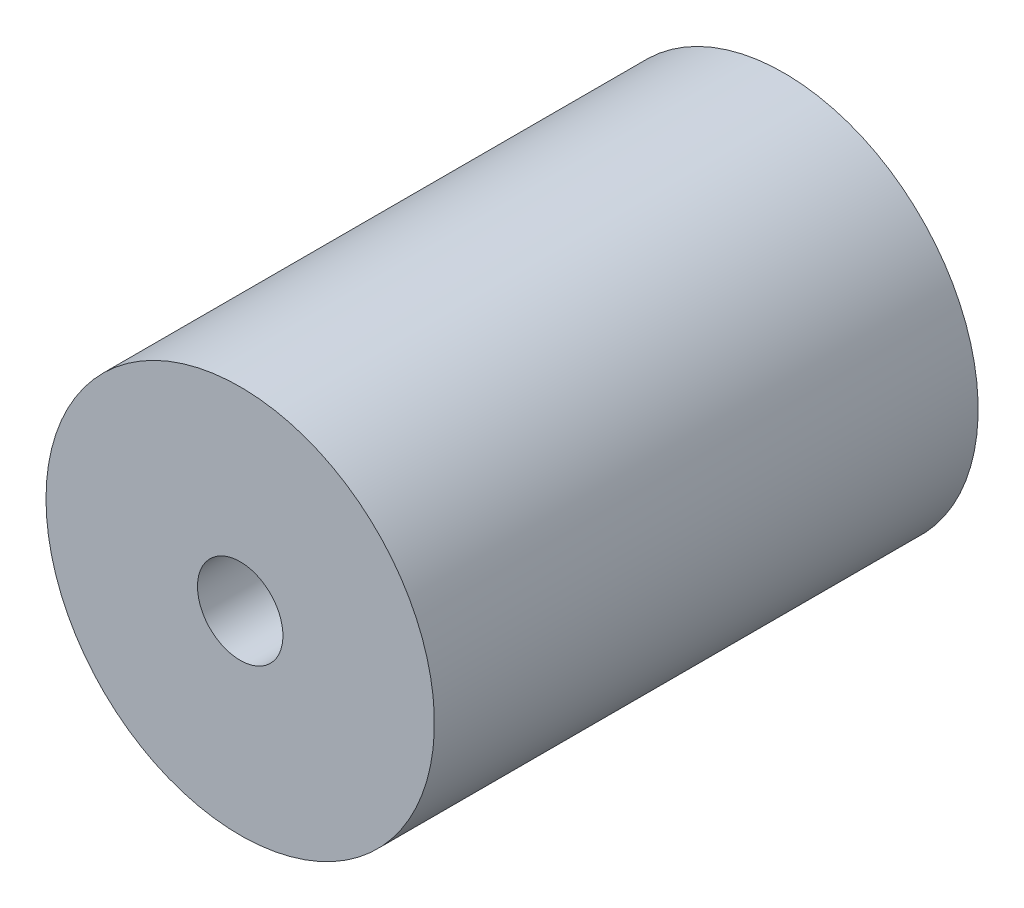
ISO-10303-21;
HEADER;
FILE_DESCRIPTION(('STEP AP214'),'2;1');
FILE_NAME('part.step','',(''),(''),'','','');
FILE_SCHEMA(('AUTOMOTIVE_DESIGN { 1 0 10303 214 1 1 1 1 }'));
ENDSEC;
DATA;
#1=APPLICATION_CONTEXT('core data for automotive mechanical design processes');
#2=APPLICATION_PROTOCOL_DEFINITION('international standard','automotive_design',2000,#1);
#3=PRODUCT_CONTEXT('',#1,'mechanical');
#4=PRODUCT('Part','Part','',(#3));
#5=PRODUCT_RELATED_PRODUCT_CATEGORY('part','',(#4));
#6=PRODUCT_DEFINITION_FORMATION('','',#4);
#7=PRODUCT_DEFINITION_CONTEXT('part definition',#1,'design');
#8=PRODUCT_DEFINITION('design','',#6,#7);
#9=PRODUCT_DEFINITION_SHAPE('','',#8);
#10=(LENGTH_UNIT() NAMED_UNIT(*) SI_UNIT(.MILLI.,.METRE.));
#11=(NAMED_UNIT(*) PLANE_ANGLE_UNIT() SI_UNIT($,.RADIAN.));
#12=(NAMED_UNIT(*) SI_UNIT($,.STERADIAN.) SOLID_ANGLE_UNIT());
#13=UNCERTAINTY_MEASURE_WITH_UNIT(LENGTH_MEASURE(1.E-05),#10,'distance_accuracy_value','');
#14=(GEOMETRIC_REPRESENTATION_CONTEXT(3) GLOBAL_UNCERTAINTY_ASSIGNED_CONTEXT((#13)) GLOBAL_UNIT_ASSIGNED_CONTEXT((#10,
#11,#12)) REPRESENTATION_CONTEXT('',''));
#15=CARTESIAN_POINT('',(0.,0.,0.));
#16=DIRECTION('',(0.,0.,1.));
#17=DIRECTION('',(1.,0.,0.));
#18=AXIS2_PLACEMENT_3D('',#15,#16,#17);
#19=CARTESIAN_POINT('',(0.,0.,21.));
#20=DIRECTION('',(0.,0.,1.));
#21=DIRECTION('',(1.,0.,0.));
#22=AXIS2_PLACEMENT_3D('',#19,#20,#21);
#23=PLANE('',#22);
#24=CARTESIAN_POINT('',(0.,0.,21.));
#25=DIRECTION('',(0.,0.,1.));
#26=DIRECTION('',(1.,0.,0.));
#27=AXIS2_PLACEMENT_3D('',#24,#25,#26);
#28=CIRCLE('',#27,7.5);
#29=CARTESIAN_POINT('',(-7.5,0.,21.));
#30=VERTEX_POINT('',#29);
#31=EDGE_CURVE('E10',#30,#30,#28,.T.);
#32=ORIENTED_EDGE('',*,*,#31,.T.);
#33=EDGE_LOOP('',(#32));
#34=FACE_BOUND('',#33,.T.);
#35=CARTESIAN_POINT('',(0.,0.,21.));
#36=DIRECTION('',(0.,0.,1.));
#37=DIRECTION('',(1.,0.,0.));
#38=AXIS2_PLACEMENT_3D('',#35,#36,#37);
#39=CIRCLE('',#38,1.65);
#40=CARTESIAN_POINT('',(-1.65,0.,21.));
#41=VERTEX_POINT('',#40);
#42=EDGE_CURVE('E44',#41,#41,#39,.T.);
#43=ORIENTED_EDGE('',*,*,#42,.F.);
#44=EDGE_LOOP('',(#43));
#45=FACE_BOUND('',#44,.T.);
#46=ADVANCED_FACE('F33',(#34,#45),#23,.T.);
#47=CARTESIAN_POINT('',(0.,0.,0.));
#48=DIRECTION('',(0.,0.,1.));
#49=DIRECTION('',(1.,0.,0.));
#50=AXIS2_PLACEMENT_3D('',#47,#48,#49);
#51=PLANE('',#50);
#52=CARTESIAN_POINT('',(0.,0.,0.));
#53=DIRECTION('',(0.,0.,1.));
#54=DIRECTION('',(1.,0.,0.));
#55=AXIS2_PLACEMENT_3D('',#52,#53,#54);
#56=CIRCLE('',#55,7.5);
#57=CARTESIAN_POINT('',(-7.5,0.,0.));
#58=VERTEX_POINT('',#57);
#59=EDGE_CURVE('E37',#58,#58,#56,.T.);
#60=ORIENTED_EDGE('',*,*,#59,.F.);
#61=EDGE_LOOP('',(#60));
#62=FACE_BOUND('',#61,.T.);
#63=CARTESIAN_POINT('',(0.,0.,0.));
#64=DIRECTION('',(0.,0.,1.));
#65=DIRECTION('',(1.,0.,0.));
#66=AXIS2_PLACEMENT_3D('',#63,#64,#65);
#67=CIRCLE('',#66,1.65);
#68=CARTESIAN_POINT('',(-1.65,0.,0.));
#69=VERTEX_POINT('',#68);
#70=EDGE_CURVE('E46',#69,#69,#67,.T.);
#71=ORIENTED_EDGE('',*,*,#70,.T.);
#72=EDGE_LOOP('',(#71));
#73=FACE_BOUND('',#72,.T.);
#74=ADVANCED_FACE('F56',(#62,#73),#51,.F.);
#75=CARTESIAN_POINT('',(0.,0.,21.));
#76=DIRECTION('',(0.,0.,-1.));
#77=DIRECTION('',(-1.,0.,0.));
#78=AXIS2_PLACEMENT_3D('',#75,#76,#77);
#79=CYLINDRICAL_SURFACE('',#78,7.5);
#80=CARTESIAN_POINT('',(-7.5,0.,21.));
#81=CARTESIAN_POINT('',(-7.5,0.,20.78125));
#82=CARTESIAN_POINT('',(-7.5,0.,20.5625));
#83=CARTESIAN_POINT('',(-7.5,0.,20.125));
#84=CARTESIAN_POINT('',(-7.5,0.,19.90625));
#85=CARTESIAN_POINT('',(-7.5,0.,19.46875));
#86=CARTESIAN_POINT('',(-7.5,0.,19.25));
#87=CARTESIAN_POINT('',(-7.5,0.,18.8125));
#88=CARTESIAN_POINT('',(-7.5,0.,18.59375));
#89=CARTESIAN_POINT('',(-7.5,0.,18.15625));
#90=CARTESIAN_POINT('',(-7.5,0.,17.9375));
#91=CARTESIAN_POINT('',(-7.5,0.,17.5));
#92=CARTESIAN_POINT('',(-7.5,0.,17.28125));
#93=CARTESIAN_POINT('',(-7.5,0.,16.84375));
#94=CARTESIAN_POINT('',(-7.5,0.,16.625));
#95=CARTESIAN_POINT('',(-7.5,0.,16.1875));
#96=CARTESIAN_POINT('',(-7.5,0.,15.96875));
#97=CARTESIAN_POINT('',(-7.5,0.,15.53125));
#98=CARTESIAN_POINT('',(-7.5,0.,15.3125));
#99=CARTESIAN_POINT('',(-7.5,0.,14.875));
#100=CARTESIAN_POINT('',(-7.5,0.,14.65625));
#101=CARTESIAN_POINT('',(-7.5,0.,14.21875));
#102=CARTESIAN_POINT('',(-7.5,0.,14.));
#103=CARTESIAN_POINT('',(-7.5,0.,13.5625));
#104=CARTESIAN_POINT('',(-7.5,0.,13.34375));
#105=CARTESIAN_POINT('',(-7.5,0.,12.90625));
#106=CARTESIAN_POINT('',(-7.5,0.,12.6875));
#107=CARTESIAN_POINT('',(-7.5,0.,12.25));
#108=CARTESIAN_POINT('',(-7.5,0.,12.03125));
#109=CARTESIAN_POINT('',(-7.5,0.,11.59375));
#110=CARTESIAN_POINT('',(-7.5,0.,11.375));
#111=CARTESIAN_POINT('',(-7.5,0.,10.9375));
#112=CARTESIAN_POINT('',(-7.5,0.,10.71875));
#113=CARTESIAN_POINT('',(-7.5,0.,10.28125));
#114=CARTESIAN_POINT('',(-7.5,0.,10.0625));
#115=CARTESIAN_POINT('',(-7.5,0.,9.625));
#116=CARTESIAN_POINT('',(-7.5,0.,9.40625));
#117=CARTESIAN_POINT('',(-7.5,0.,8.96875));
#118=CARTESIAN_POINT('',(-7.5,0.,8.75));
#119=CARTESIAN_POINT('',(-7.5,0.,8.3125));
#120=CARTESIAN_POINT('',(-7.5,0.,8.09375));
#121=CARTESIAN_POINT('',(-7.5,0.,7.65625));
#122=CARTESIAN_POINT('',(-7.5,0.,7.4375));
#123=CARTESIAN_POINT('',(-7.5,0.,7.));
#124=CARTESIAN_POINT('',(-7.5,0.,6.78125));
#125=CARTESIAN_POINT('',(-7.5,0.,6.34375));
#126=CARTESIAN_POINT('',(-7.5,0.,6.125));
#127=CARTESIAN_POINT('',(-7.5,0.,5.6875));
#128=CARTESIAN_POINT('',(-7.5,0.,5.46875));
#129=CARTESIAN_POINT('',(-7.5,0.,5.03125));
#130=CARTESIAN_POINT('',(-7.5,0.,4.8125));
#131=CARTESIAN_POINT('',(-7.5,0.,4.375));
#132=CARTESIAN_POINT('',(-7.5,0.,4.15625));
#133=CARTESIAN_POINT('',(-7.5,0.,3.71875));
#134=CARTESIAN_POINT('',(-7.5,0.,3.5));
#135=CARTESIAN_POINT('',(-7.5,0.,3.0625));
#136=CARTESIAN_POINT('',(-7.5,0.,2.84375));
#137=CARTESIAN_POINT('',(-7.5,0.,2.40625));
#138=CARTESIAN_POINT('',(-7.5,0.,2.1875));
#139=CARTESIAN_POINT('',(-7.5,0.,1.75));
#140=CARTESIAN_POINT('',(-7.5,0.,1.53125));
#141=CARTESIAN_POINT('',(-7.5,0.,1.09375));
#142=CARTESIAN_POINT('',(-7.5,0.,0.875000000000001));
#143=CARTESIAN_POINT('',(-7.5,0.,0.4375));
#144=CARTESIAN_POINT('',(-7.5,0.,0.21875));
#145=CARTESIAN_POINT('',(-7.5,0.,0.));
#146=B_SPLINE_CURVE_WITH_KNOTS('',3,(#80,#81,#82,#83,#84,#85,#86,#87,#88,#89,#90,#91,#92,#93,
#94,#95,#96,#97,#98,#99,#100,#101,#102,#103,#104,#105,#106,#107,#108,#109,#110,#111,#112,#113,
#114,#115,#116,#117,#118,#119,#120,#121,#122,#123,#124,#125,#126,#127,#128,#129,#130,#131,#132,
#133,#134,#135,#136,#137,#138,#139,#140,#141,#142,#143,#144,#145),.UNSPECIFIED.,.F.,.F.,(4,2,2,
2,2,2,2,2,2,2,2,2,2,2,2,2,2,2,2,2,2,2,2,2,2,2,2,2,2,2,2,2,4),(0.,0.656249999999997,1.3125,
1.96875,2.625,3.28125,3.9375,4.59375,5.25,5.90625,6.5625,7.21875,7.875,8.53125,9.1875,9.84375,
10.5,11.15625,11.8125,12.46875,13.125,13.78125,14.4375,15.09375,15.75,16.40625,17.0625,17.71875,
18.375,19.03125,19.6875,20.34375,21.),.UNSPECIFIED.);
#147=EDGE_CURVE('BSEAM35',#30,#58,#146,.T.);
#148=ORIENTED_EDGE('',*,*,#31,.F.);
#149=ORIENTED_EDGE('',*,*,#59,.T.);
#150=ORIENTED_EDGE('',*,*,#147,.T.);
#151=ORIENTED_EDGE('',*,*,#147,.F.);
#152=EDGE_LOOP('',(#148,#150,#149,#151));
#153=FACE_BOUND('',#152,.T.);
#154=ADVANCED_FACE('F35',(#153),#79,.T.);
#155=CARTESIAN_POINT('',(0.,0.,21.));
#156=DIRECTION('',(0.,0.,-1.));
#157=DIRECTION('',(-1.,0.,0.));
#158=AXIS2_PLACEMENT_3D('',#155,#156,#157);
#159=CYLINDRICAL_SURFACE('',#158,1.65);
#160=CARTESIAN_POINT('',(-1.65,0.,21.));
#161=CARTESIAN_POINT('',(-1.65,0.,20.78125));
#162=CARTESIAN_POINT('',(-1.65,0.,20.5625));
#163=CARTESIAN_POINT('',(-1.65,0.,20.125));
#164=CARTESIAN_POINT('',(-1.65,0.,19.90625));
#165=CARTESIAN_POINT('',(-1.65,0.,19.46875));
#166=CARTESIAN_POINT('',(-1.65,0.,19.25));
#167=CARTESIAN_POINT('',(-1.65,0.,18.8125));
#168=CARTESIAN_POINT('',(-1.65,0.,18.59375));
#169=CARTESIAN_POINT('',(-1.65,0.,18.15625));
#170=CARTESIAN_POINT('',(-1.65,0.,17.9375));
#171=CARTESIAN_POINT('',(-1.65,0.,17.5));
#172=CARTESIAN_POINT('',(-1.65,0.,17.28125));
#173=CARTESIAN_POINT('',(-1.65,0.,16.84375));
#174=CARTESIAN_POINT('',(-1.65,0.,16.625));
#175=CARTESIAN_POINT('',(-1.65,0.,16.1875));
#176=CARTESIAN_POINT('',(-1.65,0.,15.96875));
#177=CARTESIAN_POINT('',(-1.65,0.,15.53125));
#178=CARTESIAN_POINT('',(-1.65,0.,15.3125));
#179=CARTESIAN_POINT('',(-1.65,0.,14.875));
#180=CARTESIAN_POINT('',(-1.65,0.,14.65625));
#181=CARTESIAN_POINT('',(-1.65,0.,14.21875));
#182=CARTESIAN_POINT('',(-1.65,0.,14.));
#183=CARTESIAN_POINT('',(-1.65,0.,13.5625));
#184=CARTESIAN_POINT('',(-1.65,0.,13.34375));
#185=CARTESIAN_POINT('',(-1.65,0.,12.90625));
#186=CARTESIAN_POINT('',(-1.65,0.,12.6875));
#187=CARTESIAN_POINT('',(-1.65,0.,12.25));
#188=CARTESIAN_POINT('',(-1.65,0.,12.03125));
#189=CARTESIAN_POINT('',(-1.65,0.,11.59375));
#190=CARTESIAN_POINT('',(-1.65,0.,11.375));
#191=CARTESIAN_POINT('',(-1.65,0.,10.9375));
#192=CARTESIAN_POINT('',(-1.65,0.,10.71875));
#193=CARTESIAN_POINT('',(-1.65,0.,10.28125));
#194=CARTESIAN_POINT('',(-1.65,0.,10.0625));
#195=CARTESIAN_POINT('',(-1.65,0.,9.625));
#196=CARTESIAN_POINT('',(-1.65,0.,9.40625));
#197=CARTESIAN_POINT('',(-1.65,0.,8.96875));
#198=CARTESIAN_POINT('',(-1.65,0.,8.75));
#199=CARTESIAN_POINT('',(-1.65,0.,8.3125));
#200=CARTESIAN_POINT('',(-1.65,0.,8.09375));
#201=CARTESIAN_POINT('',(-1.65,0.,7.65625));
#202=CARTESIAN_POINT('',(-1.65,0.,7.4375));
#203=CARTESIAN_POINT('',(-1.65,0.,7.));
#204=CARTESIAN_POINT('',(-1.65,0.,6.78125));
#205=CARTESIAN_POINT('',(-1.65,0.,6.34375));
#206=CARTESIAN_POINT('',(-1.65,0.,6.125));
#207=CARTESIAN_POINT('',(-1.65,0.,5.6875));
#208=CARTESIAN_POINT('',(-1.65,0.,5.46875));
#209=CARTESIAN_POINT('',(-1.65,0.,5.03125));
#210=CARTESIAN_POINT('',(-1.65,0.,4.8125));
#211=CARTESIAN_POINT('',(-1.65,0.,4.375));
#212=CARTESIAN_POINT('',(-1.65,0.,4.15625));
#213=CARTESIAN_POINT('',(-1.65,0.,3.71875));
#214=CARTESIAN_POINT('',(-1.65,0.,3.5));
#215=CARTESIAN_POINT('',(-1.65,0.,3.0625));
#216=CARTESIAN_POINT('',(-1.65,0.,2.84375));
#217=CARTESIAN_POINT('',(-1.65,0.,2.40625));
#218=CARTESIAN_POINT('',(-1.65,0.,2.1875));
#219=CARTESIAN_POINT('',(-1.65,0.,1.75));
#220=CARTESIAN_POINT('',(-1.65,0.,1.53125));
#221=CARTESIAN_POINT('',(-1.65,0.,1.09375));
#222=CARTESIAN_POINT('',(-1.65,0.,0.875000000000001));
#223=CARTESIAN_POINT('',(-1.65,0.,0.4375));
#224=CARTESIAN_POINT('',(-1.65,0.,0.21875));
#225=CARTESIAN_POINT('',(-1.65,0.,0.));
#226=B_SPLINE_CURVE_WITH_KNOTS('',3,(#160,#161,#162,#163,#164,#165,#166,#167,#168,#169,#170,
#171,#172,#173,#174,#175,#176,#177,#178,#179,#180,#181,#182,#183,#184,#185,#186,#187,#188,#189,
#190,#191,#192,#193,#194,#195,#196,#197,#198,#199,#200,#201,#202,#203,#204,#205,#206,#207,#208,
#209,#210,#211,#212,#213,#214,#215,#216,#217,#218,#219,#220,#221,#222,#223,#224,#225),
.UNSPECIFIED.,.F.,.F.,(4,2,2,2,2,2,2,2,2,2,2,2,2,2,2,2,2,2,2,2,2,2,2,2,2,2,2,2,2,2,2,2,4),(0.,
0.656249999999997,1.3125,1.96875,2.625,3.28125,3.9375,4.59375,5.25,5.90625,6.5625,7.21875,7.875,
8.53125,9.1875,9.84375,10.5,11.15625,11.8125,12.46875,13.125,13.78125,14.4375,15.09375,15.75,
16.40625,17.0625,17.71875,18.375,19.03125,19.6875,20.34375,21.),.UNSPECIFIED.);
#227=EDGE_CURVE('BSEAM52',#41,#69,#226,.T.);
#228=ORIENTED_EDGE('',*,*,#42,.T.);
#229=ORIENTED_EDGE('',*,*,#70,.F.);
#230=ORIENTED_EDGE('',*,*,#227,.T.);
#231=ORIENTED_EDGE('',*,*,#227,.F.);
#232=EDGE_LOOP('',(#228,#230,#229,#231));
#233=FACE_BOUND('',#232,.T.);
#234=ADVANCED_FACE('F52',(#233),#159,.F.);
#235=CLOSED_SHELL('',(#46,#74,#154,#234));
#236=MANIFOLD_SOLID_BREP('B2',#235);
#237=ADVANCED_BREP_SHAPE_REPRESENTATION('',(#18,#236),#14);
#238=SHAPE_DEFINITION_REPRESENTATION(#9,#237);
ENDSEC;
END-ISO-10303-21;
